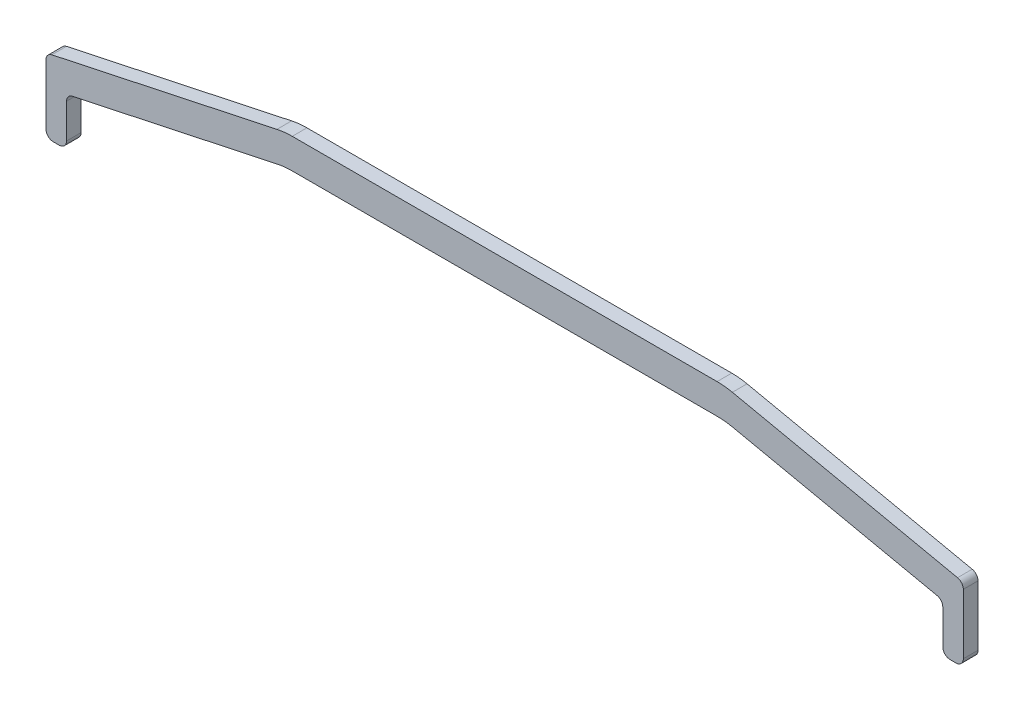
ISO-10303-21;
HEADER;
FILE_DESCRIPTION(('STEP AP214'),'2;1');
FILE_NAME('part.step','',(''),(''),'','','');
FILE_SCHEMA(('AUTOMOTIVE_DESIGN { 1 0 10303 214 1 1 1 1 }'));
ENDSEC;
DATA;
#1=APPLICATION_CONTEXT('core data for automotive mechanical design processes');
#2=APPLICATION_PROTOCOL_DEFINITION('international standard','automotive_design',2000,#1);
#3=PRODUCT_CONTEXT('',#1,'mechanical');
#4=PRODUCT('Part','Part','',(#3));
#5=PRODUCT_RELATED_PRODUCT_CATEGORY('part','',(#4));
#6=PRODUCT_DEFINITION_FORMATION('','',#4);
#7=PRODUCT_DEFINITION_CONTEXT('part definition',#1,'design');
#8=PRODUCT_DEFINITION('design','',#6,#7);
#9=PRODUCT_DEFINITION_SHAPE('','',#8);
#10=(LENGTH_UNIT() NAMED_UNIT(*) SI_UNIT(.MILLI.,.METRE.));
#11=(NAMED_UNIT(*) PLANE_ANGLE_UNIT() SI_UNIT($,.RADIAN.));
#12=(NAMED_UNIT(*) SI_UNIT($,.STERADIAN.) SOLID_ANGLE_UNIT());
#13=UNCERTAINTY_MEASURE_WITH_UNIT(LENGTH_MEASURE(1.E-05),#10,'distance_accuracy_value','');
#14=(GEOMETRIC_REPRESENTATION_CONTEXT(3) GLOBAL_UNCERTAINTY_ASSIGNED_CONTEXT((#13)) GLOBAL_UNIT_ASSIGNED_CONTEXT((#10,
#11,#12)) REPRESENTATION_CONTEXT('',''));
#15=CARTESIAN_POINT('',(0.,0.,0.));
#16=DIRECTION('',(0.,0.,1.));
#17=DIRECTION('',(1.,0.,0.));
#18=AXIS2_PLACEMENT_3D('',#15,#16,#17);
#19=CARTESIAN_POINT('',(0.,11.896307357147,2.));
#20=DIRECTION('',(0.,1.,0.));
#21=DIRECTION('',(0.,0.,1.));
#22=AXIS2_PLACEMENT_3D('',#19,#20,#21);
#23=PLANE('',#22);
#24=DIRECTION('',(1.,0.,0.));
#25=VECTOR('',#24,1.);
#26=CARTESIAN_POINT('',(0.,11.896307357147,0.));
#27=LINE('',#26,#25);
#28=CARTESIAN_POINT('',(-27.4687024389108,11.896307357147,0.));
#29=VERTEX_POINT('',#28);
#30=CARTESIAN_POINT('',(30.4223174036774,11.896307357147,0.));
#31=VERTEX_POINT('',#30);
#32=EDGE_CURVE('E242',#29,#31,#27,.T.);
#33=ORIENTED_EDGE('',*,*,#32,.T.);
#34=DIRECTION('',(0.,0.,-1.));
#35=VECTOR('',#34,1.);
#36=CARTESIAN_POINT('',(30.4223174036774,11.896307357147,2.));
#37=LINE('',#36,#35);
#38=CARTESIAN_POINT('',(30.4223174036774,11.896307357147,2.));
#39=VERTEX_POINT('',#38);
#40=EDGE_CURVE('E11',#39,#31,#37,.T.);
#41=ORIENTED_EDGE('',*,*,#40,.F.);
#42=DIRECTION('',(1.,0.,0.));
#43=VECTOR('',#42,1.);
#44=CARTESIAN_POINT('',(0.,11.896307357147,2.));
#45=LINE('',#44,#43);
#46=CARTESIAN_POINT('',(-27.4687024389108,11.896307357147,2.));
#47=VERTEX_POINT('',#46);
#48=EDGE_CURVE('E331',#47,#39,#45,.T.);
#49=ORIENTED_EDGE('',*,*,#48,.F.);
#50=DIRECTION('',(0.,0.,-1.));
#51=VECTOR('',#50,1.);
#52=CARTESIAN_POINT('',(-27.4687024389108,11.896307357147,2.));
#53=LINE('',#52,#51);
#54=EDGE_CURVE('E58',#47,#29,#53,.T.);
#55=ORIENTED_EDGE('',*,*,#54,.T.);
#56=EDGE_LOOP('',(#33,#41,#49,#55));
#57=FACE_BOUND('',#56,.T.);
#58=ADVANCED_FACE('F41',(#57),#23,.F.);
#59=CARTESIAN_POINT('',(30.4223174036774,1.89630735714698,2.));
#60=DIRECTION('',(0.,0.,-1.));
#61=DIRECTION('',(-1.,0.,0.));
#62=AXIS2_PLACEMENT_3D('',#59,#60,#61);
#63=CYLINDRICAL_SURFACE('',#62,10.);
#64=CARTESIAN_POINT('',(30.4223174036774,1.89630735714698,0.));
#65=DIRECTION('',(0.,0.,1.));
#66=DIRECTION('',(1.,0.,0.));
#67=AXIS2_PLACEMENT_3D('',#64,#65,#66);
#68=CIRCLE('',#67,10.);
#69=CARTESIAN_POINT('',(32.5081046637076,11.6763631599477,0.));
#70=VERTEX_POINT('',#69);
#71=EDGE_CURVE('E245',#31,#70,#68,.F.);
#72=ORIENTED_EDGE('',*,*,#71,.T.);
#73=DIRECTION('',(0.,0.,-1.));
#74=VECTOR('',#73,1.);
#75=CARTESIAN_POINT('',(32.5081046637076,11.6763631599477,2.));
#76=LINE('',#75,#74);
#77=CARTESIAN_POINT('',(32.5081046637076,11.6763631599477,2.));
#78=VERTEX_POINT('',#77);
#79=EDGE_CURVE('E50',#78,#70,#76,.T.);
#80=ORIENTED_EDGE('',*,*,#79,.F.);
#81=CARTESIAN_POINT('',(30.4223174036774,1.89630735714698,2.));
#82=DIRECTION('',(0.,0.,1.));
#83=DIRECTION('',(1.,0.,0.));
#84=AXIS2_PLACEMENT_3D('',#81,#82,#83);
#85=CIRCLE('',#84,10.);
#86=EDGE_CURVE('E145',#39,#78,#85,.F.);
#87=ORIENTED_EDGE('',*,*,#86,.F.);
#88=ORIENTED_EDGE('',*,*,#40,.T.);
#89=EDGE_LOOP('',(#72,#80,#87,#88));
#90=FACE_BOUND('',#89,.T.);
#91=ADVANCED_FACE('F401',(#90),#63,.F.);
#92=CARTESIAN_POINT('',(3.79614269641047,17.7997479022627,2.));
#93=DIRECTION('',(-0.208578726003019,-0.978005580280071,0.));
#94=DIRECTION('',(0.978005580280071,-0.208578726003019,0.));
#95=AXIS2_PLACEMENT_3D('',#92,#93,#94);
#96=PLANE('',#95);
#97=DIRECTION('',(-0.978005580280071,0.208578726003019,0.));
#98=VECTOR('',#97,1.);
#99=CARTESIAN_POINT('',(3.79614269641047,17.7997479022627,0.));
#100=LINE('',#99,#98);
#101=CARTESIAN_POINT('',(60.3853862083863,5.73099026406765,0.));
#102=VERTEX_POINT('',#101);
#103=EDGE_CURVE('E249',#102,#70,#100,.T.);
#104=ORIENTED_EDGE('',*,*,#103,.F.);
#105=DIRECTION('',(0.,0.,-1.));
#106=VECTOR('',#105,1.);
#107=CARTESIAN_POINT('',(60.3853862083863,5.73099026406765,2.));
#108=LINE('',#107,#106);
#109=CARTESIAN_POINT('',(60.3853862083863,5.73099026406765,2.));
#110=VERTEX_POINT('',#109);
#111=EDGE_CURVE('E392',#110,#102,#108,.T.);
#112=ORIENTED_EDGE('',*,*,#111,.F.);
#113=DIRECTION('',(-0.978005580280071,0.208578726003019,0.));
#114=VECTOR('',#113,1.);
#115=CARTESIAN_POINT('',(3.79614269641047,17.7997479022627,2.));
#116=LINE('',#115,#114);
#117=EDGE_CURVE('E400',#110,#78,#116,.T.);
#118=ORIENTED_EDGE('',*,*,#117,.T.);
#119=ORIENTED_EDGE('',*,*,#79,.T.);
#120=EDGE_LOOP('',(#104,#112,#118,#119));
#121=FACE_BOUND('',#120,.T.);
#122=ADVANCED_FACE('F398',(#121),#96,.T.);
#123=CARTESIAN_POINT('',(60.1768074823833,4.75298468378758,2.));
#124=DIRECTION('',(0.,0.,-1.));
#125=DIRECTION('',(-1.,0.,0.));
#126=AXIS2_PLACEMENT_3D('',#123,#124,#125);
#127=CYLINDRICAL_SURFACE('',#126,1.);
#128=CARTESIAN_POINT('',(60.1768074823833,4.75298468378758,0.));
#129=DIRECTION('',(0.,0.,1.));
#130=DIRECTION('',(1.,0.,0.));
#131=AXIS2_PLACEMENT_3D('',#128,#129,#130);
#132=CIRCLE('',#131,1.);
#133=CARTESIAN_POINT('',(61.1768074823833,4.75298468378758,0.));
#134=VERTEX_POINT('',#133);
#135=EDGE_CURVE('E253',#102,#134,#132,.F.);
#136=ORIENTED_EDGE('',*,*,#135,.T.);
#137=DIRECTION('',(0.,0.,-1.));
#138=VECTOR('',#137,1.);
#139=CARTESIAN_POINT('',(61.1768074823833,4.75298468378758,2.));
#140=LINE('',#139,#138);
#141=CARTESIAN_POINT('',(61.1768074823833,4.75298468378758,2.));
#142=VERTEX_POINT('',#141);
#143=EDGE_CURVE('E389',#142,#134,#140,.T.);
#144=ORIENTED_EDGE('',*,*,#143,.F.);
#145=CARTESIAN_POINT('',(60.1768074823833,4.75298468378758,2.));
#146=DIRECTION('',(0.,0.,1.));
#147=DIRECTION('',(1.,0.,0.));
#148=AXIS2_PLACEMENT_3D('',#145,#146,#147);
#149=CIRCLE('',#148,1.);
#150=EDGE_CURVE('E412',#110,#142,#149,.F.);
#151=ORIENTED_EDGE('',*,*,#150,.F.);
#152=ORIENTED_EDGE('',*,*,#111,.T.);
#153=EDGE_LOOP('',(#136,#144,#151,#152));
#154=FACE_BOUND('',#153,.T.);
#155=ADVANCED_FACE('F409',(#154),#127,.F.);
#156=CARTESIAN_POINT('',(61.1768074823833,0.,2.));
#157=DIRECTION('',(-1.,0.,0.));
#158=DIRECTION('',(0.,0.,1.));
#159=AXIS2_PLACEMENT_3D('',#156,#157,#158);
#160=PLANE('',#159);
#161=DIRECTION('',(0.,1.,0.));
#162=VECTOR('',#161,1.);
#163=CARTESIAN_POINT('',(61.1768074823833,0.,0.));
#164=LINE('',#163,#162);
#165=CARTESIAN_POINT('',(61.1768074823833,0.0550059871667237,0.));
#166=VERTEX_POINT('',#165);
#167=EDGE_CURVE('E257',#166,#134,#164,.T.);
#168=ORIENTED_EDGE('',*,*,#167,.F.);
#169=DIRECTION('',(0.,0.,-1.));
#170=VECTOR('',#169,1.);
#171=CARTESIAN_POINT('',(61.1768074823833,0.0550059871667237,2.));
#172=LINE('',#171,#170);
#173=CARTESIAN_POINT('',(61.1768074823833,0.0550059871667237,2.));
#174=VERTEX_POINT('',#173);
#175=EDGE_CURVE('E386',#174,#166,#172,.T.);
#176=ORIENTED_EDGE('',*,*,#175,.F.);
#177=DIRECTION('',(0.,1.,0.));
#178=VECTOR('',#177,1.);
#179=CARTESIAN_POINT('',(61.1768074823833,0.,2.));
#180=LINE('',#179,#178);
#181=EDGE_CURVE('E415',#174,#142,#180,.T.);
#182=ORIENTED_EDGE('',*,*,#181,.T.);
#183=ORIENTED_EDGE('',*,*,#143,.T.);
#184=EDGE_LOOP('',(#168,#176,#182,#183));
#185=FACE_BOUND('',#184,.T.);
#186=ADVANCED_FACE('F684',(#185),#160,.T.);
#187=CARTESIAN_POINT('',(62.1768074823833,0.0550059871667168,2.));
#188=DIRECTION('',(0.,0.,-1.));
#189=DIRECTION('',(-1.,0.,0.));
#190=AXIS2_PLACEMENT_3D('',#187,#188,#189);
#191=CYLINDRICAL_SURFACE('',#190,1.);
#192=CARTESIAN_POINT('',(62.1768074823833,0.0550059871667168,0.));
#193=DIRECTION('',(0.,0.,1.));
#194=DIRECTION('',(1.,0.,0.));
#195=AXIS2_PLACEMENT_3D('',#192,#193,#194);
#196=CIRCLE('',#195,1.);
#197=CARTESIAN_POINT('',(62.1768074823833,-0.944994012833284,0.));
#198=VERTEX_POINT('',#197);
#199=EDGE_CURVE('E261',#198,#166,#196,.F.);
#200=ORIENTED_EDGE('',*,*,#199,.F.);
#201=DIRECTION('',(0.,0.,-1.));
#202=VECTOR('',#201,1.);
#203=CARTESIAN_POINT('',(62.1768074823833,-0.944994012833284,2.));
#204=LINE('',#203,#202);
#205=CARTESIAN_POINT('',(62.1768074823833,-0.944994012833284,2.));
#206=VERTEX_POINT('',#205);
#207=EDGE_CURVE('E383',#206,#198,#204,.T.);
#208=ORIENTED_EDGE('',*,*,#207,.F.);
#209=CARTESIAN_POINT('',(62.1768074823833,0.0550059871667168,2.));
#210=DIRECTION('',(0.,0.,1.));
#211=DIRECTION('',(1.,0.,0.));
#212=AXIS2_PLACEMENT_3D('',#209,#210,#211);
#213=CIRCLE('',#212,1.);
#214=EDGE_CURVE('E425',#206,#174,#213,.F.);
#215=ORIENTED_EDGE('',*,*,#214,.T.);
#216=ORIENTED_EDGE('',*,*,#175,.T.);
#217=EDGE_LOOP('',(#200,#208,#215,#216));
#218=FACE_BOUND('',#217,.T.);
#219=ADVANCED_FACE('F674',(#218),#191,.T.);
#220=CARTESIAN_POINT('',(0.,-0.944994012833284,2.));
#221=DIRECTION('',(0.,-1.,0.));
#222=DIRECTION('',(0.,0.,-1.));
#223=AXIS2_PLACEMENT_3D('',#220,#221,#222);
#224=PLANE('',#223);
#225=DIRECTION('',(-1.,0.,0.));
#226=VECTOR('',#225,1.);
#227=CARTESIAN_POINT('',(0.,-0.944994012833284,0.));
#228=LINE('',#227,#226);
#229=CARTESIAN_POINT('',(62.9768074823833,-0.944994012833284,0.));
#230=VERTEX_POINT('',#229);
#231=EDGE_CURVE('E265',#230,#198,#228,.T.);
#232=ORIENTED_EDGE('',*,*,#231,.F.);
#233=DIRECTION('',(0.,0.,-1.));
#234=VECTOR('',#233,1.);
#235=CARTESIAN_POINT('',(62.9768074823833,-0.944994012833284,2.));
#236=LINE('',#235,#234);
#237=CARTESIAN_POINT('',(62.9768074823833,-0.944994012833284,2.));
#238=VERTEX_POINT('',#237);
#239=EDGE_CURVE('E380',#238,#230,#236,.T.);
#240=ORIENTED_EDGE('',*,*,#239,.F.);
#241=DIRECTION('',(-1.,0.,0.));
#242=VECTOR('',#241,1.);
#243=CARTESIAN_POINT('',(0.,-0.944994012833284,2.));
#244=LINE('',#243,#242);
#245=EDGE_CURVE('E429',#238,#206,#244,.T.);
#246=ORIENTED_EDGE('',*,*,#245,.T.);
#247=ORIENTED_EDGE('',*,*,#207,.T.);
#248=EDGE_LOOP('',(#232,#240,#246,#247));
#249=FACE_BOUND('',#248,.T.);
#250=ADVANCED_FACE('F664',(#249),#224,.T.);
#251=CARTESIAN_POINT('',(62.9768074823833,0.0550059871667168,2.));
#252=DIRECTION('',(0.,0.,-1.));
#253=DIRECTION('',(-1.,0.,0.));
#254=AXIS2_PLACEMENT_3D('',#251,#252,#253);
#255=CYLINDRICAL_SURFACE('',#254,1.);
#256=CARTESIAN_POINT('',(62.9768074823833,0.0550059871667168,0.));
#257=DIRECTION('',(0.,0.,1.));
#258=DIRECTION('',(1.,0.,0.));
#259=AXIS2_PLACEMENT_3D('',#256,#257,#258);
#260=CIRCLE('',#259,1.);
#261=CARTESIAN_POINT('',(63.9768074823833,0.0550059871667237,0.));
#262=VERTEX_POINT('',#261);
#263=EDGE_CURVE('E269',#262,#230,#260,.F.);
#264=ORIENTED_EDGE('',*,*,#263,.F.);
#265=DIRECTION('',(0.,0.,-1.));
#266=VECTOR('',#265,1.);
#267=CARTESIAN_POINT('',(63.9768074823833,0.0550059871667237,2.));
#268=LINE('',#267,#266);
#269=CARTESIAN_POINT('',(63.9768074823833,0.0550059871667237,2.));
#270=VERTEX_POINT('',#269);
#271=EDGE_CURVE('E377',#270,#262,#268,.T.);
#272=ORIENTED_EDGE('',*,*,#271,.F.);
#273=CARTESIAN_POINT('',(62.9768074823833,0.0550059871667168,2.));
#274=DIRECTION('',(0.,0.,1.));
#275=DIRECTION('',(1.,0.,0.));
#276=AXIS2_PLACEMENT_3D('',#273,#274,#275);
#277=CIRCLE('',#276,1.);
#278=EDGE_CURVE('E433',#270,#238,#277,.F.);
#279=ORIENTED_EDGE('',*,*,#278,.T.);
#280=ORIENTED_EDGE('',*,*,#239,.T.);
#281=EDGE_LOOP('',(#264,#272,#279,#280));
#282=FACE_BOUND('',#281,.T.);
#283=ADVANCED_FACE('F654',(#282),#255,.T.);
#284=CARTESIAN_POINT('',(63.9768074823833,0.,2.));
#285=DIRECTION('',(1.,0.,0.));
#286=DIRECTION('',(0.,0.,-1.));
#287=AXIS2_PLACEMENT_3D('',#284,#285,#286);
#288=PLANE('',#287);
#289=DIRECTION('',(0.,-1.,0.));
#290=VECTOR('',#289,1.);
#291=CARTESIAN_POINT('',(63.9768074823833,0.,0.));
#292=LINE('',#291,#290);
#293=CARTESIAN_POINT('',(63.9768074823833,8.24578639787731,0.));
#294=VERTEX_POINT('',#293);
#295=EDGE_CURVE('E273',#294,#262,#292,.T.);
#296=ORIENTED_EDGE('',*,*,#295,.F.);
#297=DIRECTION('',(0.,0.,-1.));
#298=VECTOR('',#297,1.);
#299=CARTESIAN_POINT('',(63.9768074823833,8.24578639787731,2.));
#300=LINE('',#299,#298);
#301=CARTESIAN_POINT('',(63.9768074823833,8.24578639787731,2.));
#302=VERTEX_POINT('',#301);
#303=EDGE_CURVE('E374',#302,#294,#300,.T.);
#304=ORIENTED_EDGE('',*,*,#303,.F.);
#305=DIRECTION('',(0.,-1.,0.));
#306=VECTOR('',#305,1.);
#307=CARTESIAN_POINT('',(63.9768074823833,0.,2.));
#308=LINE('',#307,#306);
#309=EDGE_CURVE('E437',#302,#270,#308,.T.);
#310=ORIENTED_EDGE('',*,*,#309,.T.);
#311=ORIENTED_EDGE('',*,*,#271,.T.);
#312=EDGE_LOOP('',(#296,#304,#310,#311));
#313=FACE_BOUND('',#312,.T.);
#314=ADVANCED_FACE('F644',(#313),#288,.T.);
#315=CARTESIAN_POINT('',(62.9768074823833,8.24578639787732,2.));
#316=DIRECTION('',(0.,0.,-1.));
#317=DIRECTION('',(-1.,0.,0.));
#318=AXIS2_PLACEMENT_3D('',#315,#316,#317);
#319=CYLINDRICAL_SURFACE('',#318,1.);
#320=CARTESIAN_POINT('',(62.9768074823833,8.24578639787732,0.));
#321=DIRECTION('',(0.,0.,1.));
#322=DIRECTION('',(1.,0.,0.));
#323=AXIS2_PLACEMENT_3D('',#320,#321,#322);
#324=CIRCLE('',#323,1.);
#325=CARTESIAN_POINT('',(63.1853862083863,9.22379197815739,0.));
#326=VERTEX_POINT('',#325);
#327=EDGE_CURVE('E277',#326,#294,#324,.F.);
#328=ORIENTED_EDGE('',*,*,#327,.F.);
#329=DIRECTION('',(0.,0.,-1.));
#330=VECTOR('',#329,1.);
#331=CARTESIAN_POINT('',(63.1853862083863,9.22379197815739,2.));
#332=LINE('',#331,#330);
#333=CARTESIAN_POINT('',(63.1853862083863,9.22379197815739,2.));
#334=VERTEX_POINT('',#333);
#335=EDGE_CURVE('E371',#334,#326,#332,.T.);
#336=ORIENTED_EDGE('',*,*,#335,.F.);
#337=CARTESIAN_POINT('',(62.9768074823833,8.24578639787732,2.));
#338=DIRECTION('',(0.,0.,1.));
#339=DIRECTION('',(1.,0.,0.));
#340=AXIS2_PLACEMENT_3D('',#337,#338,#339);
#341=CIRCLE('',#340,1.);
#342=EDGE_CURVE('E441',#334,#302,#341,.F.);
#343=ORIENTED_EDGE('',*,*,#342,.T.);
#344=ORIENTED_EDGE('',*,*,#303,.T.);
#345=EDGE_LOOP('',(#328,#336,#343,#344));
#346=FACE_BOUND('',#345,.T.);
#347=ADVANCED_FACE('F634',(#346),#319,.T.);
#348=CARTESIAN_POINT('',(4.63045760042255,21.711770223383,2.));
#349=DIRECTION('',(0.208578726003019,0.978005580280071,0.));
#350=DIRECTION('',(-0.978005580280071,0.208578726003019,0.));
#351=AXIS2_PLACEMENT_3D('',#348,#349,#350);
#352=PLANE('',#351);
#353=DIRECTION('',(0.978005580280071,-0.208578726003019,0.));
#354=VECTOR('',#353,1.);
#355=CARTESIAN_POINT('',(4.63045760042255,21.711770223383,0.));
#356=LINE('',#355,#354);
#357=CARTESIAN_POINT('',(32.5081046637076,15.7663193735457,0.));
#358=VERTEX_POINT('',#357);
#359=EDGE_CURVE('E281',#358,#326,#356,.T.);
#360=ORIENTED_EDGE('',*,*,#359,.F.);
#361=DIRECTION('',(0.,0.,-1.));
#362=VECTOR('',#361,1.);
#363=CARTESIAN_POINT('',(32.5081046637076,15.7663193735457,2.));
#364=LINE('',#363,#362);
#365=CARTESIAN_POINT('',(32.5081046637076,15.7663193735457,2.));
#366=VERTEX_POINT('',#365);
#367=EDGE_CURVE('E368',#366,#358,#364,.T.);
#368=ORIENTED_EDGE('',*,*,#367,.F.);
#369=DIRECTION('',(0.978005580280071,-0.208578726003019,0.));
#370=VECTOR('',#369,1.);
#371=CARTESIAN_POINT('',(4.63045760042255,21.711770223383,2.));
#372=LINE('',#371,#370);
#373=EDGE_CURVE('E445',#366,#334,#372,.T.);
#374=ORIENTED_EDGE('',*,*,#373,.T.);
#375=ORIENTED_EDGE('',*,*,#335,.T.);
#376=EDGE_LOOP('',(#360,#368,#374,#375));
#377=FACE_BOUND('',#376,.T.);
#378=ADVANCED_FACE('F624',(#377),#352,.T.);
#379=CARTESIAN_POINT('',(30.4223174036774,5.986263570745,2.));
#380=DIRECTION('',(0.,0.,-1.));
#381=DIRECTION('',(-1.,0.,0.));
#382=AXIS2_PLACEMENT_3D('',#379,#380,#381);
#383=CYLINDRICAL_SURFACE('',#382,10.);
#384=CARTESIAN_POINT('',(30.4223174036774,5.986263570745,0.));
#385=DIRECTION('',(0.,0.,1.));
#386=DIRECTION('',(1.,0.,0.));
#387=AXIS2_PLACEMENT_3D('',#384,#385,#386);
#388=CIRCLE('',#387,10.);
#389=CARTESIAN_POINT('',(30.4223174036774,15.986263570745,0.));
#390=VERTEX_POINT('',#389);
#391=EDGE_CURVE('E285',#390,#358,#388,.F.);
#392=ORIENTED_EDGE('',*,*,#391,.F.);
#393=DIRECTION('',(0.,0.,-1.));
#394=VECTOR('',#393,1.);
#395=CARTESIAN_POINT('',(30.4223174036774,15.986263570745,2.));
#396=LINE('',#395,#394);
#397=CARTESIAN_POINT('',(30.4223174036774,15.986263570745,2.));
#398=VERTEX_POINT('',#397);
#399=EDGE_CURVE('E365',#398,#390,#396,.T.);
#400=ORIENTED_EDGE('',*,*,#399,.F.);
#401=CARTESIAN_POINT('',(30.4223174036774,5.986263570745,2.));
#402=DIRECTION('',(0.,0.,1.));
#403=DIRECTION('',(1.,0.,0.));
#404=AXIS2_PLACEMENT_3D('',#401,#402,#403);
#405=CIRCLE('',#404,10.);
#406=EDGE_CURVE('E449',#398,#366,#405,.F.);
#407=ORIENTED_EDGE('',*,*,#406,.T.);
#408=ORIENTED_EDGE('',*,*,#367,.T.);
#409=EDGE_LOOP('',(#392,#400,#407,#408));
#410=FACE_BOUND('',#409,.T.);
#411=ADVANCED_FACE('F613',(#410),#383,.T.);
#412=CARTESIAN_POINT('',(0.,15.986263570745,2.));
#413=DIRECTION('',(0.,1.,0.));
#414=DIRECTION('',(0.,0.,1.));
#415=AXIS2_PLACEMENT_3D('',#412,#413,#414);
#416=PLANE('',#415);
#417=DIRECTION('',(1.,0.,0.));
#418=VECTOR('',#417,1.);
#419=CARTESIAN_POINT('',(0.,15.986263570745,0.));
#420=LINE('',#419,#418);
#421=CARTESIAN_POINT('',(-27.4687024389108,15.986263570745,0.));
#422=VERTEX_POINT('',#421);
#423=EDGE_CURVE('E289',#422,#390,#420,.T.);
#424=ORIENTED_EDGE('',*,*,#423,.F.);
#425=DIRECTION('',(0.,0.,-1.));
#426=VECTOR('',#425,1.);
#427=CARTESIAN_POINT('',(-27.4687024389108,15.986263570745,2.));
#428=LINE('',#427,#426);
#429=CARTESIAN_POINT('',(-27.4687024389108,15.986263570745,2.));
#430=VERTEX_POINT('',#429);
#431=EDGE_CURVE('E362',#430,#422,#428,.T.);
#432=ORIENTED_EDGE('',*,*,#431,.F.);
#433=DIRECTION('',(1.,0.,0.));
#434=VECTOR('',#433,1.);
#435=CARTESIAN_POINT('',(0.,15.986263570745,2.));
#436=LINE('',#435,#434);
#437=EDGE_CURVE('E453',#430,#398,#436,.T.);
#438=ORIENTED_EDGE('',*,*,#437,.T.);
#439=ORIENTED_EDGE('',*,*,#399,.T.);
#440=EDGE_LOOP('',(#424,#432,#438,#439));
#441=FACE_BOUND('',#440,.T.);
#442=ADVANCED_FACE('F603',(#441),#416,.T.);
#443=CARTESIAN_POINT('',(-27.4687024389108,5.986263570745,2.));
#444=DIRECTION('',(0.,0.,-1.));
#445=DIRECTION('',(-1.,0.,0.));
#446=AXIS2_PLACEMENT_3D('',#443,#444,#445);
#447=CYLINDRICAL_SURFACE('',#446,10.);
#448=CARTESIAN_POINT('',(-27.4687024389108,5.986263570745,0.));
#449=DIRECTION('',(0.,0.,1.));
#450=DIRECTION('',(1.,0.,0.));
#451=AXIS2_PLACEMENT_3D('',#448,#449,#450);
#452=CIRCLE('',#451,10.);
#453=CARTESIAN_POINT('',(-29.5544896989411,15.7663193735457,0.));
#454=VERTEX_POINT('',#453);
#455=EDGE_CURVE('E293',#422,#454,#452,.T.);
#456=ORIENTED_EDGE('',*,*,#455,.T.);
#457=DIRECTION('',(0.,0.,-1.));
#458=VECTOR('',#457,1.);
#459=CARTESIAN_POINT('',(-29.5544896989411,15.7663193735457,2.));
#460=LINE('',#459,#458);
#461=CARTESIAN_POINT('',(-29.5544896989411,15.7663193735457,2.));
#462=VERTEX_POINT('',#461);
#463=EDGE_CURVE('E358',#462,#454,#460,.T.);
#464=ORIENTED_EDGE('',*,*,#463,.F.);
#465=CARTESIAN_POINT('',(-27.4687024389108,5.986263570745,2.));
#466=DIRECTION('',(0.,0.,1.));
#467=DIRECTION('',(1.,0.,0.));
#468=AXIS2_PLACEMENT_3D('',#465,#466,#467);
#469=CIRCLE('',#468,10.);
#470=EDGE_CURVE('E457',#430,#462,#469,.T.);
#471=ORIENTED_EDGE('',*,*,#470,.F.);
#472=ORIENTED_EDGE('',*,*,#431,.T.);
#473=EDGE_LOOP('',(#456,#464,#471,#472));
#474=FACE_BOUND('',#473,.T.);
#475=ADVANCED_FACE('F593',(#474),#447,.T.);
#476=CARTESIAN_POINT('',(-4.50196033049724,21.1092588865563,2.));
#477=DIRECTION('',(0.208578726003019,-0.978005580280071,0.));
#478=DIRECTION('',(0.978005580280071,0.208578726003019,0.));
#479=AXIS2_PLACEMENT_3D('',#476,#477,#478);
#480=PLANE('',#479);
#481=DIRECTION('',(-0.978005580280071,-0.208578726003019,0.));
#482=VECTOR('',#481,1.);
#483=CARTESIAN_POINT('',(-4.50196033049724,21.1092588865563,0.));
#484=LINE('',#483,#482);
#485=CARTESIAN_POINT('',(-60.2317712436197,9.22379197815739,0.));
#486=VERTEX_POINT('',#485);
#487=EDGE_CURVE('E296',#454,#486,#484,.T.);
#488=ORIENTED_EDGE('',*,*,#487,.T.);
#489=DIRECTION('',(0.,0.,-1.));
#490=VECTOR('',#489,1.);
#491=CARTESIAN_POINT('',(-60.2317712436197,9.22379197815739,2.));
#492=LINE('',#491,#490);
#493=CARTESIAN_POINT('',(-60.2317712436197,9.22379197815739,2.));
#494=VERTEX_POINT('',#493);
#495=EDGE_CURVE('E354',#494,#486,#492,.T.);
#496=ORIENTED_EDGE('',*,*,#495,.F.);
#497=DIRECTION('',(-0.978005580280071,-0.208578726003019,0.));
#498=VECTOR('',#497,1.);
#499=CARTESIAN_POINT('',(-4.50196033049724,21.1092588865563,2.));
#500=LINE('',#499,#498);
#501=EDGE_CURVE('E460',#462,#494,#500,.T.);
#502=ORIENTED_EDGE('',*,*,#501,.F.);
#503=ORIENTED_EDGE('',*,*,#463,.T.);
#504=EDGE_LOOP('',(#488,#496,#502,#503));
#505=FACE_BOUND('',#504,.T.);
#506=ADVANCED_FACE('F583',(#505),#480,.F.);
#507=CARTESIAN_POINT('',(-60.0231925176167,8.24578639787732,2.));
#508=DIRECTION('',(0.,0.,-1.));
#509=DIRECTION('',(-1.,0.,0.));
#510=AXIS2_PLACEMENT_3D('',#507,#508,#509);
#511=CYLINDRICAL_SURFACE('',#510,1.);
#512=CARTESIAN_POINT('',(-60.0231925176167,8.24578639787732,0.));
#513=DIRECTION('',(0.,0.,1.));
#514=DIRECTION('',(1.,0.,0.));
#515=AXIS2_PLACEMENT_3D('',#512,#513,#514);
#516=CIRCLE('',#515,1.);
#517=CARTESIAN_POINT('',(-61.0231925176167,8.24578639787731,0.));
#518=VERTEX_POINT('',#517);
#519=EDGE_CURVE('E299',#486,#518,#516,.T.);
#520=ORIENTED_EDGE('',*,*,#519,.T.);
#521=DIRECTION('',(0.,0.,-1.));
#522=VECTOR('',#521,1.);
#523=CARTESIAN_POINT('',(-61.0231925176167,8.24578639787731,2.));
#524=LINE('',#523,#522);
#525=CARTESIAN_POINT('',(-61.0231925176167,8.24578639787731,2.));
#526=VERTEX_POINT('',#525);
#527=EDGE_CURVE('E350',#526,#518,#524,.T.);
#528=ORIENTED_EDGE('',*,*,#527,.F.);
#529=CARTESIAN_POINT('',(-60.0231925176167,8.24578639787732,2.));
#530=DIRECTION('',(0.,0.,1.));
#531=DIRECTION('',(1.,0.,0.));
#532=AXIS2_PLACEMENT_3D('',#529,#530,#531);
#533=CIRCLE('',#532,1.);
#534=EDGE_CURVE('E463',#494,#526,#533,.T.);
#535=ORIENTED_EDGE('',*,*,#534,.F.);
#536=ORIENTED_EDGE('',*,*,#495,.T.);
#537=EDGE_LOOP('',(#520,#528,#535,#536));
#538=FACE_BOUND('',#537,.T.);
#539=ADVANCED_FACE('F573',(#538),#511,.T.);
#540=CARTESIAN_POINT('',(-61.0231925176167,0.,2.));
#541=DIRECTION('',(1.,0.,0.));
#542=DIRECTION('',(0.,0.,-1.));
#543=AXIS2_PLACEMENT_3D('',#540,#541,#542);
#544=PLANE('',#543);
#545=DIRECTION('',(0.,-1.,0.));
#546=VECTOR('',#545,1.);
#547=CARTESIAN_POINT('',(-61.0231925176167,0.,0.));
#548=LINE('',#547,#546);
#549=CARTESIAN_POINT('',(-61.0231925176167,0.0550059871667237,0.));
#550=VERTEX_POINT('',#549);
#551=EDGE_CURVE('E302',#518,#550,#548,.T.);
#552=ORIENTED_EDGE('',*,*,#551,.T.);
#553=DIRECTION('',(0.,0.,-1.));
#554=VECTOR('',#553,1.);
#555=CARTESIAN_POINT('',(-61.0231925176167,0.0550059871667237,2.));
#556=LINE('',#555,#554);
#557=CARTESIAN_POINT('',(-61.0231925176167,0.0550059871667237,2.));
#558=VERTEX_POINT('',#557);
#559=EDGE_CURVE('E347',#558,#550,#556,.T.);
#560=ORIENTED_EDGE('',*,*,#559,.F.);
#561=DIRECTION('',(0.,-1.,0.));
#562=VECTOR('',#561,1.);
#563=CARTESIAN_POINT('',(-61.0231925176167,0.,2.));
#564=LINE('',#563,#562);
#565=EDGE_CURVE('E466',#526,#558,#564,.T.);
#566=ORIENTED_EDGE('',*,*,#565,.F.);
#567=ORIENTED_EDGE('',*,*,#527,.T.);
#568=EDGE_LOOP('',(#552,#560,#566,#567));
#569=FACE_BOUND('',#568,.T.);
#570=ADVANCED_FACE('F563',(#569),#544,.F.);
#571=CARTESIAN_POINT('',(-60.0231925176167,0.0550059871667168,2.));
#572=DIRECTION('',(0.,0.,-1.));
#573=DIRECTION('',(-1.,0.,0.));
#574=AXIS2_PLACEMENT_3D('',#571,#572,#573);
#575=CYLINDRICAL_SURFACE('',#574,1.);
#576=CARTESIAN_POINT('',(-60.0231925176167,0.0550059871667168,0.));
#577=DIRECTION('',(0.,0.,1.));
#578=DIRECTION('',(1.,0.,0.));
#579=AXIS2_PLACEMENT_3D('',#576,#577,#578);
#580=CIRCLE('',#579,1.);
#581=CARTESIAN_POINT('',(-60.0231925176167,-0.944994012833284,0.));
#582=VERTEX_POINT('',#581);
#583=EDGE_CURVE('E306',#582,#550,#580,.F.);
#584=ORIENTED_EDGE('',*,*,#583,.F.);
#585=DIRECTION('',(0.,0.,-1.));
#586=VECTOR('',#585,1.);
#587=CARTESIAN_POINT('',(-60.0231925176167,-0.944994012833284,2.));
#588=LINE('',#587,#586);
#589=CARTESIAN_POINT('',(-60.0231925176167,-0.944994012833284,2.));
#590=VERTEX_POINT('',#589);
#591=EDGE_CURVE('E344',#590,#582,#588,.T.);
#592=ORIENTED_EDGE('',*,*,#591,.F.);
#593=CARTESIAN_POINT('',(-60.0231925176167,0.0550059871667168,2.));
#594=DIRECTION('',(0.,0.,1.));
#595=DIRECTION('',(1.,0.,0.));
#596=AXIS2_PLACEMENT_3D('',#593,#594,#595);
#597=CIRCLE('',#596,1.);
#598=EDGE_CURVE('E469',#590,#558,#597,.F.);
#599=ORIENTED_EDGE('',*,*,#598,.T.);
#600=ORIENTED_EDGE('',*,*,#559,.T.);
#601=EDGE_LOOP('',(#584,#592,#599,#600));
#602=FACE_BOUND('',#601,.T.);
#603=ADVANCED_FACE('F554',(#602),#575,.T.);
#604=CARTESIAN_POINT('',(0.,-0.944994012833284,2.));
#605=DIRECTION('',(0.,1.,0.));
#606=DIRECTION('',(0.,0.,1.));
#607=AXIS2_PLACEMENT_3D('',#604,#605,#606);
#608=PLANE('',#607);
#609=DIRECTION('',(1.,0.,0.));
#610=VECTOR('',#609,1.);
#611=CARTESIAN_POINT('',(0.,-0.944994012833284,0.));
#612=LINE('',#611,#610);
#613=CARTESIAN_POINT('',(-59.2231925176167,-0.944994012833284,0.));
#614=VERTEX_POINT('',#613);
#615=EDGE_CURVE('E310',#582,#614,#612,.T.);
#616=ORIENTED_EDGE('',*,*,#615,.T.);
#617=DIRECTION('',(0.,0.,-1.));
#618=VECTOR('',#617,1.);
#619=CARTESIAN_POINT('',(-59.2231925176167,-0.944994012833284,2.));
#620=LINE('',#619,#618);
#621=CARTESIAN_POINT('',(-59.2231925176167,-0.944994012833284,2.));
#622=VERTEX_POINT('',#621);
#623=EDGE_CURVE('E341',#622,#614,#620,.T.);
#624=ORIENTED_EDGE('',*,*,#623,.F.);
#625=DIRECTION('',(1.,0.,0.));
#626=VECTOR('',#625,1.);
#627=CARTESIAN_POINT('',(0.,-0.944994012833284,2.));
#628=LINE('',#627,#626);
#629=EDGE_CURVE('E473',#590,#622,#628,.T.);
#630=ORIENTED_EDGE('',*,*,#629,.F.);
#631=ORIENTED_EDGE('',*,*,#591,.T.);
#632=EDGE_LOOP('',(#616,#624,#630,#631));
#633=FACE_BOUND('',#632,.T.);
#634=ADVANCED_FACE('F484',(#633),#608,.F.);
#635=CARTESIAN_POINT('',(-59.2231925176167,0.0550059871667168,2.));
#636=DIRECTION('',(0.,0.,-1.));
#637=DIRECTION('',(-1.,0.,0.));
#638=AXIS2_PLACEMENT_3D('',#635,#636,#637);
#639=CYLINDRICAL_SURFACE('',#638,1.);
#640=CARTESIAN_POINT('',(-59.2231925176167,0.0550059871667168,0.));
#641=DIRECTION('',(0.,0.,1.));
#642=DIRECTION('',(1.,0.,0.));
#643=AXIS2_PLACEMENT_3D('',#640,#641,#642);
#644=CIRCLE('',#643,1.);
#645=CARTESIAN_POINT('',(-58.2231925176167,0.0550059871667237,0.));
#646=VERTEX_POINT('',#645);
#647=EDGE_CURVE('E314',#646,#614,#644,.F.);
#648=ORIENTED_EDGE('',*,*,#647,.F.);
#649=DIRECTION('',(0.,0.,-1.));
#650=VECTOR('',#649,1.);
#651=CARTESIAN_POINT('',(-58.2231925176167,0.0550059871667237,2.));
#652=LINE('',#651,#650);
#653=CARTESIAN_POINT('',(-58.2231925176167,0.0550059871667237,2.));
#654=VERTEX_POINT('',#653);
#655=EDGE_CURVE('E338',#654,#646,#652,.T.);
#656=ORIENTED_EDGE('',*,*,#655,.F.);
#657=CARTESIAN_POINT('',(-59.2231925176167,0.0550059871667168,2.));
#658=DIRECTION('',(0.,0.,1.));
#659=DIRECTION('',(1.,0.,0.));
#660=AXIS2_PLACEMENT_3D('',#657,#658,#659);
#661=CIRCLE('',#660,1.);
#662=EDGE_CURVE('E236',#654,#622,#661,.F.);
#663=ORIENTED_EDGE('',*,*,#662,.T.);
#664=ORIENTED_EDGE('',*,*,#623,.T.);
#665=EDGE_LOOP('',(#648,#656,#663,#664));
#666=FACE_BOUND('',#665,.T.);
#667=ADVANCED_FACE('F479',(#666),#639,.T.);
#668=CARTESIAN_POINT('',(-58.2231925176167,0.,2.));
#669=DIRECTION('',(-1.,0.,0.));
#670=DIRECTION('',(0.,0.,1.));
#671=AXIS2_PLACEMENT_3D('',#668,#669,#670);
#672=PLANE('',#671);
#673=DIRECTION('',(0.,1.,0.));
#674=VECTOR('',#673,1.);
#675=CARTESIAN_POINT('',(-58.2231925176167,0.,0.));
#676=LINE('',#675,#674);
#677=CARTESIAN_POINT('',(-58.2231925176167,4.75298468378758,0.));
#678=VERTEX_POINT('',#677);
#679=EDGE_CURVE('E318',#646,#678,#676,.T.);
#680=ORIENTED_EDGE('',*,*,#679,.T.);
#681=DIRECTION('',(0.,0.,-1.));
#682=VECTOR('',#681,1.);
#683=CARTESIAN_POINT('',(-58.2231925176167,4.75298468378758,2.));
#684=LINE('',#683,#682);
#685=CARTESIAN_POINT('',(-58.2231925176167,4.75298468378758,2.));
#686=VERTEX_POINT('',#685);
#687=EDGE_CURVE('E219',#686,#678,#684,.T.);
#688=ORIENTED_EDGE('',*,*,#687,.F.);
#689=DIRECTION('',(0.,1.,0.));
#690=VECTOR('',#689,1.);
#691=CARTESIAN_POINT('',(-58.2231925176167,0.,2.));
#692=LINE('',#691,#690);
#693=EDGE_CURVE('E231',#654,#686,#692,.T.);
#694=ORIENTED_EDGE('',*,*,#693,.F.);
#695=ORIENTED_EDGE('',*,*,#655,.T.);
#696=EDGE_LOOP('',(#680,#688,#694,#695));
#697=FACE_BOUND('',#696,.T.);
#698=ADVANCED_FACE('F489',(#697),#672,.F.);
#699=CARTESIAN_POINT('',(-57.2231925176167,4.75298468378758,2.));
#700=DIRECTION('',(0.,0.,-1.));
#701=DIRECTION('',(-1.,0.,0.));
#702=AXIS2_PLACEMENT_3D('',#699,#700,#701);
#703=CYLINDRICAL_SURFACE('',#702,1.);
#704=CARTESIAN_POINT('',(-57.2231925176167,4.75298468378758,0.));
#705=DIRECTION('',(0.,0.,1.));
#706=DIRECTION('',(1.,0.,0.));
#707=AXIS2_PLACEMENT_3D('',#704,#705,#706);
#708=CIRCLE('',#707,1.);
#709=CARTESIAN_POINT('',(-57.4317712436197,5.73099026406766,0.));
#710=VERTEX_POINT('',#709);
#711=EDGE_CURVE('E215',#710,#678,#708,.T.);
#712=ORIENTED_EDGE('',*,*,#711,.F.);
#713=DIRECTION('',(0.,0.,-1.));
#714=VECTOR('',#713,1.);
#715=CARTESIAN_POINT('',(-57.4317712436197,5.73099026406766,2.));
#716=LINE('',#715,#714);
#717=CARTESIAN_POINT('',(-57.4317712436197,5.73099026406766,2.));
#718=VERTEX_POINT('',#717);
#719=EDGE_CURVE('E209',#718,#710,#716,.T.);
#720=ORIENTED_EDGE('',*,*,#719,.F.);
#721=CARTESIAN_POINT('',(-57.2231925176167,4.75298468378758,2.));
#722=DIRECTION('',(0.,0.,1.));
#723=DIRECTION('',(1.,0.,0.));
#724=AXIS2_PLACEMENT_3D('',#721,#722,#723);
#725=CIRCLE('',#724,1.);
#726=EDGE_CURVE('E213',#718,#686,#725,.T.);
#727=ORIENTED_EDGE('',*,*,#726,.T.);
#728=ORIENTED_EDGE('',*,*,#687,.T.);
#729=EDGE_LOOP('',(#712,#720,#727,#728));
#730=FACE_BOUND('',#729,.T.);
#731=ADVANCED_FACE('F211',(#730),#703,.F.);
#732=CARTESIAN_POINT('',(-3.66764542648517,17.197236565436,2.));
#733=DIRECTION('',(-0.208578726003019,0.978005580280071,0.));
#734=DIRECTION('',(-0.978005580280071,-0.208578726003019,0.));
#735=AXIS2_PLACEMENT_3D('',#732,#733,#734);
#736=PLANE('',#735);
#737=DIRECTION('',(0.978005580280071,0.208578726003019,0.));
#738=VECTOR('',#737,1.);
#739=CARTESIAN_POINT('',(-3.66764542648517,17.197236565436,0.));
#740=LINE('',#739,#738);
#741=CARTESIAN_POINT('',(-29.5544896989411,11.6763631599477,0.));
#742=VERTEX_POINT('',#741);
#743=EDGE_CURVE('E324',#710,#742,#740,.T.);
#744=ORIENTED_EDGE('',*,*,#743,.T.);
#745=DIRECTION('',(0.,0.,-1.));
#746=VECTOR('',#745,1.);
#747=CARTESIAN_POINT('',(-29.5544896989411,11.6763631599477,2.));
#748=LINE('',#747,#746);
#749=CARTESIAN_POINT('',(-29.5544896989411,11.6763631599477,2.));
#750=VERTEX_POINT('',#749);
#751=EDGE_CURVE('E133',#750,#742,#748,.T.);
#752=ORIENTED_EDGE('',*,*,#751,.F.);
#753=DIRECTION('',(0.978005580280071,0.208578726003019,0.));
#754=VECTOR('',#753,1.);
#755=CARTESIAN_POINT('',(-3.66764542648517,17.197236565436,2.));
#756=LINE('',#755,#754);
#757=EDGE_CURVE('E221',#718,#750,#756,.T.);
#758=ORIENTED_EDGE('',*,*,#757,.F.);
#759=ORIENTED_EDGE('',*,*,#719,.T.);
#760=EDGE_LOOP('',(#744,#752,#758,#759));
#761=FACE_BOUND('',#760,.T.);
#762=ADVANCED_FACE('F222',(#761),#736,.F.);
#763=CARTESIAN_POINT('',(-27.4687024389108,1.89630735714698,2.));
#764=DIRECTION('',(0.,0.,-1.));
#765=DIRECTION('',(-1.,0.,0.));
#766=AXIS2_PLACEMENT_3D('',#763,#764,#765);
#767=CYLINDRICAL_SURFACE('',#766,10.);
#768=CARTESIAN_POINT('',(-27.4687024389108,1.89630735714698,0.));
#769=DIRECTION('',(0.,0.,1.));
#770=DIRECTION('',(1.,0.,0.));
#771=AXIS2_PLACEMENT_3D('',#768,#769,#770);
#772=CIRCLE('',#771,10.);
#773=EDGE_CURVE('E327',#29,#742,#772,.T.);
#774=ORIENTED_EDGE('',*,*,#773,.F.);
#775=ORIENTED_EDGE('',*,*,#54,.F.);
#776=CARTESIAN_POINT('',(-27.4687024389108,1.89630735714698,2.));
#777=DIRECTION('',(0.,0.,1.));
#778=DIRECTION('',(1.,0.,0.));
#779=AXIS2_PLACEMENT_3D('',#776,#777,#778);
#780=CIRCLE('',#779,10.);
#781=EDGE_CURVE('E226',#47,#750,#780,.T.);
#782=ORIENTED_EDGE('',*,*,#781,.T.);
#783=ORIENTED_EDGE('',*,*,#751,.T.);
#784=EDGE_LOOP('',(#774,#775,#782,#783));
#785=FACE_BOUND('',#784,.T.);
#786=ADVANCED_FACE('F502',(#785),#767,.F.);
#787=CARTESIAN_POINT('',(0.,0.,2.));
#788=DIRECTION('',(0.,0.,1.));
#789=DIRECTION('',(1.,0.,0.));
#790=AXIS2_PLACEMENT_3D('',#787,#788,#789);
#791=PLANE('',#790);
#792=ORIENTED_EDGE('',*,*,#48,.T.);
#793=ORIENTED_EDGE('',*,*,#86,.T.);
#794=ORIENTED_EDGE('',*,*,#117,.F.);
#795=ORIENTED_EDGE('',*,*,#150,.T.);
#796=ORIENTED_EDGE('',*,*,#181,.F.);
#797=ORIENTED_EDGE('',*,*,#214,.F.);
#798=ORIENTED_EDGE('',*,*,#245,.F.);
#799=ORIENTED_EDGE('',*,*,#278,.F.);
#800=ORIENTED_EDGE('',*,*,#309,.F.);
#801=ORIENTED_EDGE('',*,*,#342,.F.);
#802=ORIENTED_EDGE('',*,*,#373,.F.);
#803=ORIENTED_EDGE('',*,*,#406,.F.);
#804=ORIENTED_EDGE('',*,*,#437,.F.);
#805=ORIENTED_EDGE('',*,*,#470,.T.);
#806=ORIENTED_EDGE('',*,*,#501,.T.);
#807=ORIENTED_EDGE('',*,*,#534,.T.);
#808=ORIENTED_EDGE('',*,*,#565,.T.);
#809=ORIENTED_EDGE('',*,*,#598,.F.);
#810=ORIENTED_EDGE('',*,*,#629,.T.);
#811=ORIENTED_EDGE('',*,*,#662,.F.);
#812=ORIENTED_EDGE('',*,*,#693,.T.);
#813=ORIENTED_EDGE('',*,*,#726,.F.);
#814=ORIENTED_EDGE('',*,*,#757,.T.);
#815=ORIENTED_EDGE('',*,*,#781,.F.);
#816=EDGE_LOOP('',(#792,#793,#794,#795,#796,#797,#798,#799,#800,#801,#802,#803,#804,#805,#806,
#807,#808,#809,#810,#811,#812,#813,#814,#815));
#817=FACE_BOUND('',#816,.T.);
#818=ADVANCED_FACE('F228',(#817),#791,.T.);
#819=CARTESIAN_POINT('',(0.,0.,0.));
#820=DIRECTION('',(0.,0.,1.));
#821=DIRECTION('',(1.,0.,0.));
#822=AXIS2_PLACEMENT_3D('',#819,#820,#821);
#823=PLANE('',#822);
#824=ORIENTED_EDGE('',*,*,#32,.F.);
#825=ORIENTED_EDGE('',*,*,#773,.T.);
#826=ORIENTED_EDGE('',*,*,#743,.F.);
#827=ORIENTED_EDGE('',*,*,#711,.T.);
#828=ORIENTED_EDGE('',*,*,#679,.F.);
#829=ORIENTED_EDGE('',*,*,#647,.T.);
#830=ORIENTED_EDGE('',*,*,#615,.F.);
#831=ORIENTED_EDGE('',*,*,#583,.T.);
#832=ORIENTED_EDGE('',*,*,#551,.F.);
#833=ORIENTED_EDGE('',*,*,#519,.F.);
#834=ORIENTED_EDGE('',*,*,#487,.F.);
#835=ORIENTED_EDGE('',*,*,#455,.F.);
#836=ORIENTED_EDGE('',*,*,#423,.T.);
#837=ORIENTED_EDGE('',*,*,#391,.T.);
#838=ORIENTED_EDGE('',*,*,#359,.T.);
#839=ORIENTED_EDGE('',*,*,#327,.T.);
#840=ORIENTED_EDGE('',*,*,#295,.T.);
#841=ORIENTED_EDGE('',*,*,#263,.T.);
#842=ORIENTED_EDGE('',*,*,#231,.T.);
#843=ORIENTED_EDGE('',*,*,#199,.T.);
#844=ORIENTED_EDGE('',*,*,#167,.T.);
#845=ORIENTED_EDGE('',*,*,#135,.F.);
#846=ORIENTED_EDGE('',*,*,#103,.T.);
#847=ORIENTED_EDGE('',*,*,#71,.F.);
#848=EDGE_LOOP('',(#824,#825,#826,#827,#828,#829,#830,#831,#832,#833,#834,#835,#836,#837,#838,
#839,#840,#841,#842,#843,#844,#845,#846,#847));
#849=FACE_BOUND('',#848,.T.);
#850=ADVANCED_FACE('F405',(#849),#823,.F.);
#851=CLOSED_SHELL('',(#58,#91,#122,#155,#186,#219,#250,#283,#314,#347,#378,#411,#442,#475,#506,
#539,#570,#603,#634,#667,#698,#731,#762,#786,#818,#850));
#852=MANIFOLD_SOLID_BREP('B2',#851);
#853=ADVANCED_BREP_SHAPE_REPRESENTATION('',(#18,#852),#14);
#854=SHAPE_DEFINITION_REPRESENTATION(#9,#853);
ENDSEC;
END-ISO-10303-21;
